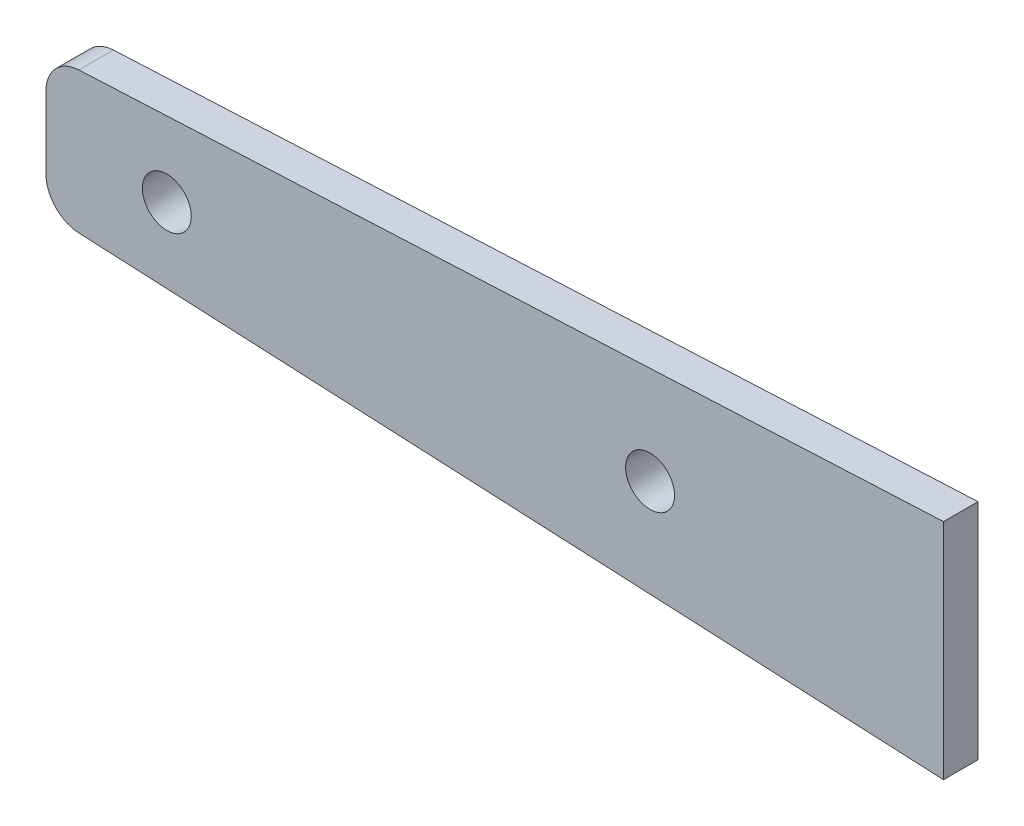
ISO-10303-21;
HEADER;
FILE_DESCRIPTION(('STEP AP214'),'2;1');
FILE_NAME('part.step','',(''),(''),'','','');
FILE_SCHEMA(('AUTOMOTIVE_DESIGN { 1 0 10303 214 1 1 1 1 }'));
ENDSEC;
DATA;
#1=APPLICATION_CONTEXT('core data for automotive mechanical design processes');
#2=APPLICATION_PROTOCOL_DEFINITION('international standard','automotive_design',2000,#1);
#3=PRODUCT_CONTEXT('',#1,'mechanical');
#4=PRODUCT('Part','Part','',(#3));
#5=PRODUCT_RELATED_PRODUCT_CATEGORY('part','',(#4));
#6=PRODUCT_DEFINITION_FORMATION('','',#4);
#7=PRODUCT_DEFINITION_CONTEXT('part definition',#1,'design');
#8=PRODUCT_DEFINITION('design','',#6,#7);
#9=PRODUCT_DEFINITION_SHAPE('','',#8);
#10=(LENGTH_UNIT() NAMED_UNIT(*) SI_UNIT(.MILLI.,.METRE.));
#11=(NAMED_UNIT(*) PLANE_ANGLE_UNIT() SI_UNIT($,.RADIAN.));
#12=(NAMED_UNIT(*) SI_UNIT($,.STERADIAN.) SOLID_ANGLE_UNIT());
#13=UNCERTAINTY_MEASURE_WITH_UNIT(LENGTH_MEASURE(1.E-05),#10,'distance_accuracy_value','');
#14=(GEOMETRIC_REPRESENTATION_CONTEXT(3) GLOBAL_UNCERTAINTY_ASSIGNED_CONTEXT((#13)) GLOBAL_UNIT_ASSIGNED_CONTEXT((#10,
#11,#12)) REPRESENTATION_CONTEXT('',''));
#15=CARTESIAN_POINT('',(0.,0.,0.));
#16=DIRECTION('',(0.,0.,1.));
#17=DIRECTION('',(1.,0.,0.));
#18=AXIS2_PLACEMENT_3D('',#15,#16,#17);
#19=CARTESIAN_POINT('',(-0.377121040723982,-7.91954185520362,3.175));
#20=DIRECTION('',(0.0475651494154494,0.998868137724438,0.));
#21=DIRECTION('',(-0.998868137724438,0.0475651494154494,0.));
#22=AXIS2_PLACEMENT_3D('',#19,#20,#21);
#23=PLANE('',#22);
#24=DIRECTION('',(0.998868137724438,-0.0475651494154494,0.));
#25=VECTOR('',#24,1.);
#26=CARTESIAN_POINT('',(-0.377121040723982,-7.91954185520362,3.175));
#27=LINE('',#26,#25);
#28=CARTESIAN_POINT('',(-30.3135193493941,-6.49399907860028,3.175));
#29=VERTEX_POINT('',#28);
#30=CARTESIAN_POINT('',(49.2125,-10.2809523809524,3.175));
#31=VERTEX_POINT('',#30);
#32=EDGE_CURVE('E95',#29,#31,#27,.T.);
#33=ORIENTED_EDGE('',*,*,#32,.F.);
#34=DIRECTION('',(0.,0.,-1.));
#35=VECTOR('',#34,1.);
#36=CARTESIAN_POINT('',(-30.3135193493941,-6.49399907860028,3.175));
#37=LINE('',#36,#35);
#38=CARTESIAN_POINT('',(-30.3135193493941,-6.49399907860028,0.));
#39=VERTEX_POINT('',#38);
#40=EDGE_CURVE('E113',#29,#39,#37,.T.);
#41=ORIENTED_EDGE('',*,*,#40,.T.);
#42=DIRECTION('',(0.998868137724438,-0.0475651494154494,0.));
#43=VECTOR('',#42,1.);
#44=CARTESIAN_POINT('',(-0.377121040723982,-7.91954185520362,0.));
#45=LINE('',#44,#43);
#46=CARTESIAN_POINT('',(49.2125,-10.2809523809524,0.));
#47=VERTEX_POINT('',#46);
#48=EDGE_CURVE('E109',#39,#47,#45,.T.);
#49=ORIENTED_EDGE('',*,*,#48,.T.);
#50=DIRECTION('',(0.,0.,-1.));
#51=VECTOR('',#50,1.);
#52=CARTESIAN_POINT('',(49.2125,-10.2809523809524,3.175));
#53=LINE('',#52,#51);
#54=EDGE_CURVE('E107',#31,#47,#53,.T.);
#55=ORIENTED_EDGE('',*,*,#54,.F.);
#56=EDGE_LOOP('',(#33,#41,#49,#55));
#57=FACE_BOUND('',#56,.T.);
#58=ADVANCED_FACE('F41',(#57),#23,.F.);
#59=CARTESIAN_POINT('',(49.2125,0.,3.175));
#60=DIRECTION('',(1.,0.,0.));
#61=DIRECTION('',(0.,0.,-1.));
#62=AXIS2_PLACEMENT_3D('',#59,#60,#61);
#63=PLANE('',#62);
#64=DIRECTION('',(0.,-1.,0.));
#65=VECTOR('',#64,1.);
#66=CARTESIAN_POINT('',(49.2125,0.,0.));
#67=LINE('',#66,#65);
#68=CARTESIAN_POINT('',(49.2125,10.2809523809524,0.));
#69=VERTEX_POINT('',#68);
#70=EDGE_CURVE('E127',#69,#47,#67,.T.);
#71=ORIENTED_EDGE('',*,*,#70,.F.);
#72=DIRECTION('',(0.,0.,-1.));
#73=VECTOR('',#72,1.);
#74=CARTESIAN_POINT('',(49.2125,10.2809523809524,3.175));
#75=LINE('',#74,#73);
#76=CARTESIAN_POINT('',(49.2125,10.2809523809524,3.175));
#77=VERTEX_POINT('',#76);
#78=EDGE_CURVE('E114',#77,#69,#75,.T.);
#79=ORIENTED_EDGE('',*,*,#78,.F.);
#80=DIRECTION('',(0.,-1.,0.));
#81=VECTOR('',#80,1.);
#82=CARTESIAN_POINT('',(49.2125,0.,3.175));
#83=LINE('',#82,#81);
#84=EDGE_CURVE('E99',#77,#31,#83,.T.);
#85=ORIENTED_EDGE('',*,*,#84,.T.);
#86=ORIENTED_EDGE('',*,*,#54,.T.);
#87=EDGE_LOOP('',(#71,#79,#85,#86));
#88=FACE_BOUND('',#87,.T.);
#89=ADVANCED_FACE('F117',(#88),#63,.T.);
#90=CARTESIAN_POINT('',(-0.377121040723982,7.91954185520362,3.175));
#91=DIRECTION('',(-0.0475651494154494,0.998868137724438,0.));
#92=DIRECTION('',(-0.998868137724438,-0.0475651494154494,0.));
#93=AXIS2_PLACEMENT_3D('',#90,#91,#92);
#94=PLANE('',#93);
#95=DIRECTION('',(0.998868137724438,0.0475651494154494,0.));
#96=VECTOR('',#95,1.);
#97=CARTESIAN_POINT('',(-0.377121040723982,7.91954185520362,0.));
#98=LINE('',#97,#96);
#99=CARTESIAN_POINT('',(-30.3135193493941,6.49399907860028,0.));
#100=VERTEX_POINT('',#99);
#101=EDGE_CURVE('E130',#100,#69,#98,.T.);
#102=ORIENTED_EDGE('',*,*,#101,.F.);
#103=DIRECTION('',(0.,0.,-1.));
#104=VECTOR('',#103,1.);
#105=CARTESIAN_POINT('',(-30.3135193493941,6.49399907860028,3.175));
#106=LINE('',#105,#104);
#107=CARTESIAN_POINT('',(-30.3135193493941,6.49399907860028,3.175));
#108=VERTEX_POINT('',#107);
#109=EDGE_CURVE('E11',#100,#108,#106,.F.);
#110=ORIENTED_EDGE('',*,*,#109,.T.);
#111=DIRECTION('',(0.998868137724438,0.0475651494154494,0.));
#112=VECTOR('',#111,1.);
#113=CARTESIAN_POINT('',(-0.377121040723982,7.91954185520362,3.175));
#114=LINE('',#113,#112);
#115=EDGE_CURVE('E119',#108,#77,#114,.T.);
#116=ORIENTED_EDGE('',*,*,#115,.T.);
#117=ORIENTED_EDGE('',*,*,#78,.T.);
#118=EDGE_LOOP('',(#102,#110,#116,#117));
#119=FACE_BOUND('',#118,.T.);
#120=ADVANCED_FACE('F151',(#119),#94,.T.);
#121=CARTESIAN_POINT('',(-33.3375,0.,3.175));
#122=DIRECTION('',(1.,0.,0.));
#123=DIRECTION('',(0.,0.,-1.));
#124=AXIS2_PLACEMENT_3D('',#121,#122,#123);
#125=PLANE('',#124);
#126=DIRECTION('',(0.,-1.,0.));
#127=VECTOR('',#126,1.);
#128=CARTESIAN_POINT('',(-33.3375,0.,0.));
#129=LINE('',#128,#127);
#130=CARTESIAN_POINT('',(-33.3375,3.32259274132519,0.));
#131=VERTEX_POINT('',#130);
#132=CARTESIAN_POINT('',(-33.3375,-3.32259274132519,0.));
#133=VERTEX_POINT('',#132);
#134=EDGE_CURVE('E104',#131,#133,#129,.T.);
#135=ORIENTED_EDGE('',*,*,#134,.T.);
#136=DIRECTION('',(0.,0.,-1.));
#137=VECTOR('',#136,1.);
#138=CARTESIAN_POINT('',(-33.3375,-3.32259274132519,3.175));
#139=LINE('',#138,#137);
#140=CARTESIAN_POINT('',(-33.3375,-3.32259274132519,3.175));
#141=VERTEX_POINT('',#140);
#142=EDGE_CURVE('E62',#133,#141,#139,.F.);
#143=ORIENTED_EDGE('',*,*,#142,.T.);
#144=DIRECTION('',(0.,-1.,0.));
#145=VECTOR('',#144,1.);
#146=CARTESIAN_POINT('',(-33.3375,0.,3.175));
#147=LINE('',#146,#145);
#148=CARTESIAN_POINT('',(-33.3375,3.32259274132519,3.175));
#149=VERTEX_POINT('',#148);
#150=EDGE_CURVE('E121',#149,#141,#147,.T.);
#151=ORIENTED_EDGE('',*,*,#150,.F.);
#152=DIRECTION('',(0.,0.,-1.));
#153=VECTOR('',#152,1.);
#154=CARTESIAN_POINT('',(-33.3375,3.32259274132519,0.));
#155=LINE('',#154,#153);
#156=EDGE_CURVE('E139',#149,#131,#155,.T.);
#157=ORIENTED_EDGE('',*,*,#156,.T.);
#158=EDGE_LOOP('',(#135,#143,#151,#157));
#159=FACE_BOUND('',#158,.T.);
#160=ADVANCED_FACE('F147',(#159),#125,.F.);
#161=CARTESIAN_POINT('',(0.,0.,3.175));
#162=DIRECTION('',(0.,0.,1.));
#163=DIRECTION('',(1.,0.,0.));
#164=AXIS2_PLACEMENT_3D('',#161,#162,#163);
#165=PLANE('',#164);
#166=CARTESIAN_POINT('',(-22.225,0.,3.175));
#167=DIRECTION('',(0.,0.,1.));
#168=DIRECTION('',(1.,0.,0.));
#169=AXIS2_PLACEMENT_3D('',#166,#167,#168);
#170=CIRCLE('',#169,2.24999999999999);
#171=CARTESIAN_POINT('',(-19.975,0.,3.175));
#172=VERTEX_POINT('',#171);
#173=EDGE_CURVE('E194',#172,#172,#170,.T.);
#174=ORIENTED_EDGE('',*,*,#173,.F.);
#175=EDGE_LOOP('',(#174));
#176=FACE_BOUND('',#175,.T.);
#177=CARTESIAN_POINT('',(22.225,0.,3.175));
#178=DIRECTION('',(0.,0.,1.));
#179=DIRECTION('',(1.,0.,0.));
#180=AXIS2_PLACEMENT_3D('',#177,#178,#179);
#181=CIRCLE('',#180,2.24999999999999);
#182=CARTESIAN_POINT('',(24.475,0.,3.175));
#183=VERTEX_POINT('',#182);
#184=EDGE_CURVE('E189',#183,#183,#181,.T.);
#185=ORIENTED_EDGE('',*,*,#184,.F.);
#186=EDGE_LOOP('',(#185));
#187=FACE_BOUND('',#186,.T.);
#188=ORIENTED_EDGE('',*,*,#150,.T.);
#189=CARTESIAN_POINT('',(-30.1625,-3.32259274132519,3.175));
#190=DIRECTION('',(0.,0.,1.));
#191=DIRECTION('',(1.,0.,0.));
#192=AXIS2_PLACEMENT_3D('',#189,#190,#191);
#193=CIRCLE('',#192,3.175);
#194=EDGE_CURVE('E49',#141,#29,#193,.T.);
#195=ORIENTED_EDGE('',*,*,#194,.T.);
#196=ORIENTED_EDGE('',*,*,#32,.T.);
#197=ORIENTED_EDGE('',*,*,#84,.F.);
#198=ORIENTED_EDGE('',*,*,#115,.F.);
#199=CARTESIAN_POINT('',(-30.1625,3.32259274132519,3.175));
#200=DIRECTION('',(0.,0.,1.));
#201=DIRECTION('',(1.,0.,0.));
#202=AXIS2_PLACEMENT_3D('',#199,#200,#201);
#203=CIRCLE('',#202,3.175);
#204=EDGE_CURVE('E143',#108,#149,#203,.T.);
#205=ORIENTED_EDGE('',*,*,#204,.T.);
#206=EDGE_LOOP('',(#188,#195,#196,#197,#198,#205));
#207=FACE_BOUND('',#206,.T.);
#208=ADVANCED_FACE('F97',(#176,#187,#207),#165,.T.);
#209=CARTESIAN_POINT('',(0.,0.,0.));
#210=DIRECTION('',(0.,0.,1.));
#211=DIRECTION('',(1.,0.,0.));
#212=AXIS2_PLACEMENT_3D('',#209,#210,#211);
#213=PLANE('',#212);
#214=CARTESIAN_POINT('',(-22.225,0.,0.));
#215=DIRECTION('',(0.,0.,1.));
#216=DIRECTION('',(1.,0.,0.));
#217=AXIS2_PLACEMENT_3D('',#214,#215,#216);
#218=CIRCLE('',#217,2.25);
#219=CARTESIAN_POINT('',(-19.975,0.,0.));
#220=VERTEX_POINT('',#219);
#221=EDGE_CURVE('E191',#220,#220,#218,.T.);
#222=ORIENTED_EDGE('',*,*,#221,.T.);
#223=EDGE_LOOP('',(#222));
#224=FACE_BOUND('',#223,.T.);
#225=CARTESIAN_POINT('',(22.225,0.,0.));
#226=DIRECTION('',(0.,0.,1.));
#227=DIRECTION('',(1.,0.,0.));
#228=AXIS2_PLACEMENT_3D('',#225,#226,#227);
#229=CIRCLE('',#228,2.25);
#230=CARTESIAN_POINT('',(24.475,0.,0.));
#231=VERTEX_POINT('',#230);
#232=EDGE_CURVE('E128',#231,#231,#229,.T.);
#233=ORIENTED_EDGE('',*,*,#232,.T.);
#234=EDGE_LOOP('',(#233));
#235=FACE_BOUND('',#234,.T.);
#236=ORIENTED_EDGE('',*,*,#48,.F.);
#237=CARTESIAN_POINT('',(-30.1625,-3.32259274132519,0.));
#238=DIRECTION('',(0.,0.,1.));
#239=DIRECTION('',(1.,0.,0.));
#240=AXIS2_PLACEMENT_3D('',#237,#238,#239);
#241=CIRCLE('',#240,3.175);
#242=EDGE_CURVE('E137',#39,#133,#241,.F.);
#243=ORIENTED_EDGE('',*,*,#242,.T.);
#244=ORIENTED_EDGE('',*,*,#134,.F.);
#245=CARTESIAN_POINT('',(-30.1625,3.32259274132519,0.));
#246=DIRECTION('',(0.,0.,1.));
#247=DIRECTION('',(1.,0.,0.));
#248=AXIS2_PLACEMENT_3D('',#245,#246,#247);
#249=CIRCLE('',#248,3.175);
#250=EDGE_CURVE('E135',#131,#100,#249,.F.);
#251=ORIENTED_EDGE('',*,*,#250,.T.);
#252=ORIENTED_EDGE('',*,*,#101,.T.);
#253=ORIENTED_EDGE('',*,*,#70,.T.);
#254=EDGE_LOOP('',(#236,#243,#244,#251,#252,#253));
#255=FACE_BOUND('',#254,.T.);
#256=ADVANCED_FACE('F150',(#224,#235,#255),#213,.F.);
#257=CARTESIAN_POINT('',(22.225,0.,3.175));
#258=DIRECTION('',(0.,0.,1.));
#259=DIRECTION('',(1.,0.,0.));
#260=AXIS2_PLACEMENT_3D('',#257,#258,#259);
#261=CYLINDRICAL_SURFACE('',#260,2.24999999999999);
#262=ORIENTED_EDGE('',*,*,#232,.F.);
#263=EDGE_LOOP('',(#262));
#264=FACE_BOUND('',#263,.T.);
#265=ORIENTED_EDGE('',*,*,#184,.T.);
#266=EDGE_LOOP('',(#265));
#267=FACE_BOUND('',#266,.T.);
#268=ADVANCED_FACE('F161',(#264,#267),#261,.F.);
#269=CARTESIAN_POINT('',(-22.225,0.,3.175));
#270=DIRECTION('',(0.,0.,1.));
#271=DIRECTION('',(1.,0.,0.));
#272=AXIS2_PLACEMENT_3D('',#269,#270,#271);
#273=CYLINDRICAL_SURFACE('',#272,2.24999999999999);
#274=ORIENTED_EDGE('',*,*,#221,.F.);
#275=EDGE_LOOP('',(#274));
#276=FACE_BOUND('',#275,.T.);
#277=ORIENTED_EDGE('',*,*,#173,.T.);
#278=EDGE_LOOP('',(#277));
#279=FACE_BOUND('',#278,.T.);
#280=ADVANCED_FACE('F155',(#276,#279),#273,.F.);
#281=CARTESIAN_POINT('',(-30.1625,-3.32259274132519,3.175));
#282=DIRECTION('',(0.,0.,-1.));
#283=DIRECTION('',(-1.,0.,0.));
#284=AXIS2_PLACEMENT_3D('',#281,#282,#283);
#285=CYLINDRICAL_SURFACE('',#284,3.175);
#286=ORIENTED_EDGE('',*,*,#194,.F.);
#287=ORIENTED_EDGE('',*,*,#142,.F.);
#288=ORIENTED_EDGE('',*,*,#242,.F.);
#289=ORIENTED_EDGE('',*,*,#40,.F.);
#290=EDGE_LOOP('',(#286,#287,#288,#289));
#291=FACE_BOUND('',#290,.T.);
#292=ADVANCED_FACE('F153',(#291),#285,.T.);
#293=CARTESIAN_POINT('',(-30.1625,3.32259274132519,3.175));
#294=DIRECTION('',(0.,0.,1.));
#295=DIRECTION('',(1.,0.,0.));
#296=AXIS2_PLACEMENT_3D('',#293,#294,#295);
#297=CYLINDRICAL_SURFACE('',#296,3.175);
#298=ORIENTED_EDGE('',*,*,#204,.F.);
#299=ORIENTED_EDGE('',*,*,#109,.F.);
#300=ORIENTED_EDGE('',*,*,#250,.F.);
#301=ORIENTED_EDGE('',*,*,#156,.F.);
#302=EDGE_LOOP('',(#298,#299,#300,#301));
#303=FACE_BOUND('',#302,.T.);
#304=ADVANCED_FACE('F43',(#303),#297,.T.);
#305=CLOSED_SHELL('',(#58,#89,#120,#160,#208,#256,#268,#280,#292,#304));
#306=MANIFOLD_SOLID_BREP('B2',#305);
#307=ADVANCED_BREP_SHAPE_REPRESENTATION('',(#18,#306),#14);
#308=SHAPE_DEFINITION_REPRESENTATION(#9,#307);
ENDSEC;
END-ISO-10303-21;
